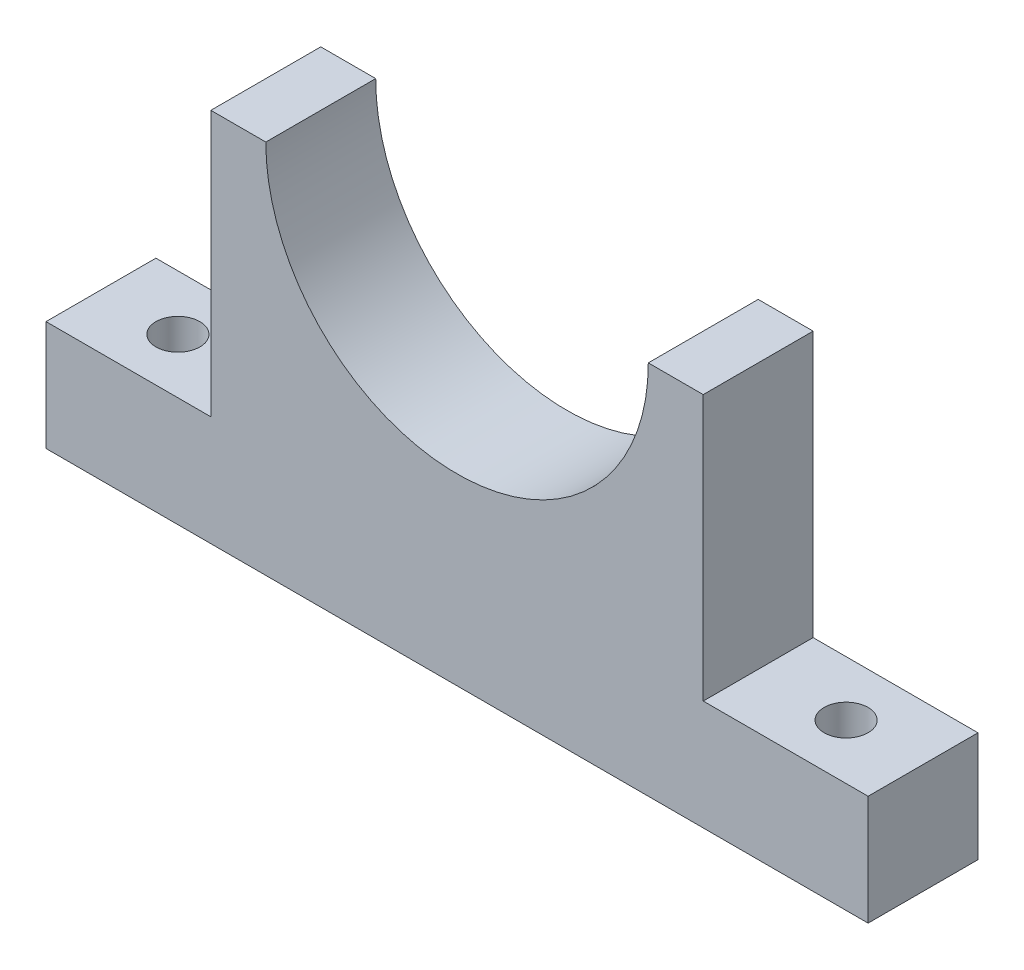
ISO-10303-21;
HEADER;
FILE_DESCRIPTION(('STEP AP214'),'2;1');
FILE_NAME('part.step','',(''),(''),'','','');
FILE_SCHEMA(('AUTOMOTIVE_DESIGN { 1 0 10303 214 1 1 1 1 }'));
ENDSEC;
DATA;
#1=APPLICATION_CONTEXT('core data for automotive mechanical design processes');
#2=APPLICATION_PROTOCOL_DEFINITION('international standard','automotive_design',2000,#1);
#3=PRODUCT_CONTEXT('',#1,'mechanical');
#4=PRODUCT('Part','Part','',(#3));
#5=PRODUCT_RELATED_PRODUCT_CATEGORY('part','',(#4));
#6=PRODUCT_DEFINITION_FORMATION('','',#4);
#7=PRODUCT_DEFINITION_CONTEXT('part definition',#1,'design');
#8=PRODUCT_DEFINITION('design','',#6,#7);
#9=PRODUCT_DEFINITION_SHAPE('','',#8);
#10=(LENGTH_UNIT() NAMED_UNIT(*) SI_UNIT(.MILLI.,.METRE.));
#11=(NAMED_UNIT(*) PLANE_ANGLE_UNIT() SI_UNIT($,.RADIAN.));
#12=(NAMED_UNIT(*) SI_UNIT($,.STERADIAN.) SOLID_ANGLE_UNIT());
#13=UNCERTAINTY_MEASURE_WITH_UNIT(LENGTH_MEASURE(1.E-05),#10,'distance_accuracy_value','');
#14=(GEOMETRIC_REPRESENTATION_CONTEXT(3) GLOBAL_UNCERTAINTY_ASSIGNED_CONTEXT((#13)) GLOBAL_UNIT_ASSIGNED_CONTEXT((#10,
#11,#12)) REPRESENTATION_CONTEXT('',''));
#15=CARTESIAN_POINT('',(0.,0.,0.));
#16=DIRECTION('',(0.,0.,1.));
#17=DIRECTION('',(1.,0.,0.));
#18=AXIS2_PLACEMENT_3D('',#15,#16,#17);
#19=CARTESIAN_POINT('',(22.3999281607712,-17.075,10.));
#20=DIRECTION('',(-1.,0.,0.));
#21=DIRECTION('',(0.,-1.,0.));
#22=AXIS2_PLACEMENT_3D('',#19,#20,#21);
#23=PLANE('',#22);
#24=DIRECTION('',(0.,0.,1.));
#25=VECTOR('',#24,1.);
#26=CARTESIAN_POINT('',(22.3999281607712,-7.075,10.));
#27=LINE('',#26,#25);
#28=CARTESIAN_POINT('',(22.3999281607712,-7.075,0.));
#29=VERTEX_POINT('',#28);
#30=CARTESIAN_POINT('',(22.3999281607712,-7.075,10.));
#31=VERTEX_POINT('',#30);
#32=EDGE_CURVE('E54',#29,#31,#27,.T.);
#33=ORIENTED_EDGE('',*,*,#32,.F.);
#34=DIRECTION('',(0.,1.,0.));
#35=VECTOR('',#34,1.);
#36=CARTESIAN_POINT('',(22.3999281607712,-17.075,0.));
#37=LINE('',#36,#35);
#38=CARTESIAN_POINT('',(22.3999281607712,17.075,0.));
#39=VERTEX_POINT('',#38);
#40=EDGE_CURVE('E176',#29,#39,#37,.T.);
#41=ORIENTED_EDGE('',*,*,#40,.T.);
#42=DIRECTION('',(0.,0.,-1.));
#43=VECTOR('',#42,1.);
#44=CARTESIAN_POINT('',(22.3999281607712,17.075,10.));
#45=LINE('',#44,#43);
#46=CARTESIAN_POINT('',(22.3999281607712,17.075,10.));
#47=VERTEX_POINT('',#46);
#48=EDGE_CURVE('E182',#47,#39,#45,.T.);
#49=ORIENTED_EDGE('',*,*,#48,.F.);
#50=DIRECTION('',(0.,1.,0.));
#51=VECTOR('',#50,1.);
#52=CARTESIAN_POINT('',(22.3999281607712,-17.075,10.));
#53=LINE('',#52,#51);
#54=EDGE_CURVE('E129',#31,#47,#53,.T.);
#55=ORIENTED_EDGE('',*,*,#54,.F.);
#56=EDGE_LOOP('',(#33,#41,#49,#55));
#57=FACE_BOUND('',#56,.T.);
#58=ADVANCED_FACE('F39',(#57),#23,.F.);
#59=CARTESIAN_POINT('',(-22.3999281607712,-17.075,10.));
#60=DIRECTION('',(1.,0.,0.));
#61=DIRECTION('',(0.,1.,0.));
#62=AXIS2_PLACEMENT_3D('',#59,#60,#61);
#63=PLANE('',#62);
#64=DIRECTION('',(0.,0.,-1.));
#65=VECTOR('',#64,1.);
#66=CARTESIAN_POINT('',(-22.3999281607712,-7.075,0.));
#67=LINE('',#66,#65);
#68=CARTESIAN_POINT('',(-22.3999281607712,-7.075,10.));
#69=VERTEX_POINT('',#68);
#70=CARTESIAN_POINT('',(-22.3999281607712,-7.075,0.));
#71=VERTEX_POINT('',#70);
#72=EDGE_CURVE('E62',#69,#71,#67,.T.);
#73=ORIENTED_EDGE('',*,*,#72,.F.);
#74=DIRECTION('',(0.,-1.,0.));
#75=VECTOR('',#74,1.);
#76=CARTESIAN_POINT('',(-22.3999281607712,-17.075,10.));
#77=LINE('',#76,#75);
#78=CARTESIAN_POINT('',(-22.3999281607713,17.075,10.));
#79=VERTEX_POINT('',#78);
#80=EDGE_CURVE('E130',#79,#69,#77,.T.);
#81=ORIENTED_EDGE('',*,*,#80,.F.);
#82=DIRECTION('',(0.,0.,-1.));
#83=VECTOR('',#82,1.);
#84=CARTESIAN_POINT('',(-22.3999281607713,17.075,10.));
#85=LINE('',#84,#83);
#86=CARTESIAN_POINT('',(-22.3999281607713,17.075,0.));
#87=VERTEX_POINT('',#86);
#88=EDGE_CURVE('E195',#79,#87,#85,.T.);
#89=ORIENTED_EDGE('',*,*,#88,.T.);
#90=DIRECTION('',(0.,-1.,0.));
#91=VECTOR('',#90,1.);
#92=CARTESIAN_POINT('',(-22.3999281607712,-17.075,0.));
#93=LINE('',#92,#91);
#94=EDGE_CURVE('E189',#87,#71,#93,.T.);
#95=ORIENTED_EDGE('',*,*,#94,.T.);
#96=EDGE_LOOP('',(#73,#81,#89,#95));
#97=FACE_BOUND('',#96,.T.);
#98=ADVANCED_FACE('F211',(#97),#63,.F.);
#99=CARTESIAN_POINT('',(17.3999281607712,17.075,10.));
#100=DIRECTION('',(0.,-1.,0.));
#101=DIRECTION('',(0.,0.,-1.));
#102=AXIS2_PLACEMENT_3D('',#99,#100,#101);
#103=PLANE('',#102);
#104=DIRECTION('',(-1.,0.,0.));
#105=VECTOR('',#104,1.);
#106=CARTESIAN_POINT('',(17.3999281607712,17.075,0.));
#107=LINE('',#106,#105);
#108=CARTESIAN_POINT('',(17.3999281607712,17.075,0.));
#109=VERTEX_POINT('',#108);
#110=EDGE_CURVE('E172',#39,#109,#107,.T.);
#111=ORIENTED_EDGE('',*,*,#110,.T.);
#112=DIRECTION('',(0.,0.,-1.));
#113=VECTOR('',#112,1.);
#114=CARTESIAN_POINT('',(17.3999281607712,17.075,10.));
#115=LINE('',#114,#113);
#116=CARTESIAN_POINT('',(17.3999281607712,17.075,10.));
#117=VERTEX_POINT('',#116);
#118=EDGE_CURVE('E11',#117,#109,#115,.T.);
#119=ORIENTED_EDGE('',*,*,#118,.F.);
#120=DIRECTION('',(-1.,0.,0.));
#121=VECTOR('',#120,1.);
#122=CARTESIAN_POINT('',(17.3999281607712,17.075,10.));
#123=LINE('',#122,#121);
#124=EDGE_CURVE('E173',#47,#117,#123,.T.);
#125=ORIENTED_EDGE('',*,*,#124,.F.);
#126=ORIENTED_EDGE('',*,*,#48,.T.);
#127=EDGE_LOOP('',(#111,#119,#125,#126));
#128=FACE_BOUND('',#127,.T.);
#129=ADVANCED_FACE('F41',(#128),#103,.F.);
#130=CARTESIAN_POINT('',(0.,17.025,10.));
#131=DIRECTION('',(0.,0.,-1.));
#132=DIRECTION('',(-1.,0.,0.));
#133=AXIS2_PLACEMENT_3D('',#130,#131,#132);
#134=CYLINDRICAL_SURFACE('',#133,17.4);
#135=CARTESIAN_POINT('',(0.,17.025,0.));
#136=DIRECTION('',(0.,0.,-1.));
#137=DIRECTION('',(-1.,0.,0.));
#138=AXIS2_PLACEMENT_3D('',#135,#136,#137);
#139=CIRCLE('',#138,17.4);
#140=CARTESIAN_POINT('',(-17.3999281607713,17.075,0.));
#141=VERTEX_POINT('',#140);
#142=EDGE_CURVE('E185',#109,#141,#139,.T.);
#143=ORIENTED_EDGE('',*,*,#142,.T.);
#144=DIRECTION('',(0.,0.,-1.));
#145=VECTOR('',#144,1.);
#146=CARTESIAN_POINT('',(-17.3999281607713,17.075,10.));
#147=LINE('',#146,#145);
#148=CARTESIAN_POINT('',(-17.3999281607713,17.075,10.));
#149=VERTEX_POINT('',#148);
#150=EDGE_CURVE('E47',#149,#141,#147,.T.);
#151=ORIENTED_EDGE('',*,*,#150,.F.);
#152=CARTESIAN_POINT('',(0.,17.025,10.));
#153=DIRECTION('',(0.,0.,-1.));
#154=DIRECTION('',(-1.,0.,0.));
#155=AXIS2_PLACEMENT_3D('',#152,#153,#154);
#156=CIRCLE('',#155,17.4);
#157=EDGE_CURVE('E175',#117,#149,#156,.T.);
#158=ORIENTED_EDGE('',*,*,#157,.F.);
#159=ORIENTED_EDGE('',*,*,#118,.T.);
#160=EDGE_LOOP('',(#143,#151,#158,#159));
#161=FACE_BOUND('',#160,.T.);
#162=ADVANCED_FACE('F217',(#161),#134,.F.);
#163=CARTESIAN_POINT('',(-22.3999281607713,17.075,10.));
#164=DIRECTION('',(0.,-1.,0.));
#165=DIRECTION('',(0.,0.,-1.));
#166=AXIS2_PLACEMENT_3D('',#163,#164,#165);
#167=PLANE('',#166);
#168=DIRECTION('',(-1.,0.,0.));
#169=VECTOR('',#168,1.);
#170=CARTESIAN_POINT('',(-22.3999281607713,17.075,0.));
#171=LINE('',#170,#169);
#172=EDGE_CURVE('E187',#141,#87,#171,.T.);
#173=ORIENTED_EDGE('',*,*,#172,.T.);
#174=ORIENTED_EDGE('',*,*,#88,.F.);
#175=DIRECTION('',(-1.,0.,0.));
#176=VECTOR('',#175,1.);
#177=CARTESIAN_POINT('',(-22.3999281607713,17.075,10.));
#178=LINE('',#177,#176);
#179=EDGE_CURVE('E178',#149,#79,#178,.T.);
#180=ORIENTED_EDGE('',*,*,#179,.F.);
#181=ORIENTED_EDGE('',*,*,#150,.T.);
#182=EDGE_LOOP('',(#173,#174,#180,#181));
#183=FACE_BOUND('',#182,.T.);
#184=ADVANCED_FACE('F202',(#183),#167,.F.);
#185=CARTESIAN_POINT('',(-22.3999281607712,-17.075,10.));
#186=DIRECTION('',(0.,1.,0.));
#187=DIRECTION('',(0.,0.,1.));
#188=AXIS2_PLACEMENT_3D('',#185,#186,#187);
#189=PLANE('',#188);
#190=CARTESIAN_POINT('',(-30.3999281607712,-17.075,5.));
#191=DIRECTION('',(0.,1.,0.));
#192=DIRECTION('',(0.,0.,1.));
#193=AXIS2_PLACEMENT_3D('',#190,#191,#192);
#194=CIRCLE('',#193,2.);
#195=CARTESIAN_POINT('',(-30.3999281607712,-17.075,7.));
#196=VERTEX_POINT('',#195);
#197=EDGE_CURVE('E145',#196,#196,#194,.T.);
#198=ORIENTED_EDGE('',*,*,#197,.T.);
#199=EDGE_LOOP('',(#198));
#200=FACE_BOUND('',#199,.T.);
#201=CARTESIAN_POINT('',(30.3999281607712,-17.075,5.00000000000004));
#202=DIRECTION('',(0.,1.,0.));
#203=DIRECTION('',(0.,0.,1.));
#204=AXIS2_PLACEMENT_3D('',#201,#202,#203);
#205=CIRCLE('',#204,2.);
#206=CARTESIAN_POINT('',(30.3999281607712,-17.075,7.00000000000004));
#207=VERTEX_POINT('',#206);
#208=EDGE_CURVE('E354',#207,#207,#205,.T.);
#209=ORIENTED_EDGE('',*,*,#208,.T.);
#210=EDGE_LOOP('',(#209));
#211=FACE_BOUND('',#210,.T.);
#212=DIRECTION('',(1.,0.,0.));
#213=VECTOR('',#212,1.);
#214=CARTESIAN_POINT('',(-22.3999281607712,-17.075,0.));
#215=LINE('',#214,#213);
#216=CARTESIAN_POINT('',(-37.3999281607712,-17.075,0.));
#217=VERTEX_POINT('',#216);
#218=CARTESIAN_POINT('',(37.3999281607712,-17.075,0.));
#219=VERTEX_POINT('',#218);
#220=EDGE_CURVE('E135',#217,#219,#215,.T.);
#221=ORIENTED_EDGE('',*,*,#220,.T.);
#222=DIRECTION('',(0.,0.,-1.));
#223=VECTOR('',#222,1.);
#224=CARTESIAN_POINT('',(37.3999281607712,-17.075,10.));
#225=LINE('',#224,#223);
#226=CARTESIAN_POINT('',(37.3999281607712,-17.075,10.));
#227=VERTEX_POINT('',#226);
#228=EDGE_CURVE('E133',#227,#219,#225,.T.);
#229=ORIENTED_EDGE('',*,*,#228,.F.);
#230=DIRECTION('',(1.,0.,0.));
#231=VECTOR('',#230,1.);
#232=CARTESIAN_POINT('',(-22.3999281607712,-17.075,10.));
#233=LINE('',#232,#231);
#234=CARTESIAN_POINT('',(-37.3999281607712,-17.075,10.));
#235=VERTEX_POINT('',#234);
#236=EDGE_CURVE('E117',#235,#227,#233,.T.);
#237=ORIENTED_EDGE('',*,*,#236,.F.);
#238=DIRECTION('',(0.,0.,1.));
#239=VECTOR('',#238,1.);
#240=CARTESIAN_POINT('',(-37.3999281607712,-17.075,0.));
#241=LINE('',#240,#239);
#242=EDGE_CURVE('E160',#217,#235,#241,.T.);
#243=ORIENTED_EDGE('',*,*,#242,.F.);
#244=EDGE_LOOP('',(#221,#229,#237,#243));
#245=FACE_BOUND('',#244,.T.);
#246=ADVANCED_FACE('F134',(#200,#211,#245),#189,.F.);
#247=CARTESIAN_POINT('',(0.,17.025,10.));
#248=DIRECTION('',(0.,0.,-1.));
#249=DIRECTION('',(-1.,0.,0.));
#250=AXIS2_PLACEMENT_3D('',#247,#248,#249);
#251=PLANE('',#250);
#252=ORIENTED_EDGE('',*,*,#124,.T.);
#253=ORIENTED_EDGE('',*,*,#157,.T.);
#254=ORIENTED_EDGE('',*,*,#179,.T.);
#255=ORIENTED_EDGE('',*,*,#80,.T.);
#256=DIRECTION('',(1.,0.,0.));
#257=VECTOR('',#256,1.);
#258=CARTESIAN_POINT('',(-37.3999281607712,-7.07500000000001,10.));
#259=LINE('',#258,#257);
#260=CARTESIAN_POINT('',(-37.3999281607712,-7.07500000000001,10.));
#261=VERTEX_POINT('',#260);
#262=EDGE_CURVE('E169',#261,#69,#259,.T.);
#263=ORIENTED_EDGE('',*,*,#262,.F.);
#264=DIRECTION('',(0.,1.,0.));
#265=VECTOR('',#264,1.);
#266=CARTESIAN_POINT('',(-37.3999281607712,-17.075,10.));
#267=LINE('',#266,#265);
#268=EDGE_CURVE('E125',#235,#261,#267,.T.);
#269=ORIENTED_EDGE('',*,*,#268,.F.);
#270=ORIENTED_EDGE('',*,*,#236,.T.);
#271=DIRECTION('',(0.,-1.,0.));
#272=VECTOR('',#271,1.);
#273=CARTESIAN_POINT('',(37.3999281607712,-17.075,10.));
#274=LINE('',#273,#272);
#275=CARTESIAN_POINT('',(37.3999281607712,-7.075,10.));
#276=VERTEX_POINT('',#275);
#277=EDGE_CURVE('E123',#276,#227,#274,.T.);
#278=ORIENTED_EDGE('',*,*,#277,.F.);
#279=DIRECTION('',(-1.,0.,0.));
#280=VECTOR('',#279,1.);
#281=CARTESIAN_POINT('',(37.3999281607712,-7.075,10.));
#282=LINE('',#281,#280);
#283=EDGE_CURVE('E151',#276,#31,#282,.T.);
#284=ORIENTED_EDGE('',*,*,#283,.T.);
#285=ORIENTED_EDGE('',*,*,#54,.T.);
#286=EDGE_LOOP('',(#252,#253,#254,#255,#263,#269,#270,#278,#284,#285));
#287=FACE_BOUND('',#286,.T.);
#288=ADVANCED_FACE('F120',(#287),#251,.F.);
#289=CARTESIAN_POINT('',(0.,17.025,0.));
#290=DIRECTION('',(0.,0.,-1.));
#291=DIRECTION('',(-1.,0.,0.));
#292=AXIS2_PLACEMENT_3D('',#289,#290,#291);
#293=PLANE('',#292);
#294=ORIENTED_EDGE('',*,*,#110,.F.);
#295=ORIENTED_EDGE('',*,*,#40,.F.);
#296=DIRECTION('',(-1.,0.,0.));
#297=VECTOR('',#296,1.);
#298=CARTESIAN_POINT('',(37.3999281607712,-7.075,0.));
#299=LINE('',#298,#297);
#300=CARTESIAN_POINT('',(37.3999281607712,-7.075,0.));
#301=VERTEX_POINT('',#300);
#302=EDGE_CURVE('E154',#301,#29,#299,.T.);
#303=ORIENTED_EDGE('',*,*,#302,.F.);
#304=DIRECTION('',(0.,1.,0.));
#305=VECTOR('',#304,1.);
#306=CARTESIAN_POINT('',(37.3999281607712,-17.075,0.));
#307=LINE('',#306,#305);
#308=EDGE_CURVE('E138',#219,#301,#307,.T.);
#309=ORIENTED_EDGE('',*,*,#308,.F.);
#310=ORIENTED_EDGE('',*,*,#220,.F.);
#311=DIRECTION('',(0.,-1.,0.));
#312=VECTOR('',#311,1.);
#313=CARTESIAN_POINT('',(-37.3999281607712,-17.075,0.));
#314=LINE('',#313,#312);
#315=CARTESIAN_POINT('',(-37.3999281607712,-7.07500000000001,0.));
#316=VERTEX_POINT('',#315);
#317=EDGE_CURVE('E157',#316,#217,#314,.T.);
#318=ORIENTED_EDGE('',*,*,#317,.F.);
#319=DIRECTION('',(1.,0.,0.));
#320=VECTOR('',#319,1.);
#321=CARTESIAN_POINT('',(-37.3999281607712,-7.07500000000001,0.));
#322=LINE('',#321,#320);
#323=EDGE_CURVE('E165',#316,#71,#322,.T.);
#324=ORIENTED_EDGE('',*,*,#323,.T.);
#325=ORIENTED_EDGE('',*,*,#94,.F.);
#326=ORIENTED_EDGE('',*,*,#172,.F.);
#327=ORIENTED_EDGE('',*,*,#142,.F.);
#328=EDGE_LOOP('',(#294,#295,#303,#309,#310,#318,#324,#325,#326,#327));
#329=FACE_BOUND('',#328,.T.);
#330=ADVANCED_FACE('F208',(#329),#293,.T.);
#331=CARTESIAN_POINT('',(-37.3999281607712,-7.07500000000001,0.));
#332=DIRECTION('',(0.,-1.,0.));
#333=DIRECTION('',(1.,0.,0.));
#334=AXIS2_PLACEMENT_3D('',#331,#332,#333);
#335=PLANE('',#334);
#336=CARTESIAN_POINT('',(-30.3999281607712,-7.075,5.));
#337=DIRECTION('',(0.,1.,0.));
#338=DIRECTION('',(-1.,0.,0.));
#339=AXIS2_PLACEMENT_3D('',#336,#337,#338);
#340=CIRCLE('',#339,2.);
#341=CARTESIAN_POINT('',(-32.3999281607713,-7.075,5.));
#342=VERTEX_POINT('',#341);
#343=EDGE_CURVE('E351',#342,#342,#340,.T.);
#344=ORIENTED_EDGE('',*,*,#343,.F.);
#345=EDGE_LOOP('',(#344));
#346=FACE_BOUND('',#345,.T.);
#347=ORIENTED_EDGE('',*,*,#72,.T.);
#348=ORIENTED_EDGE('',*,*,#323,.F.);
#349=DIRECTION('',(0.,0.,-1.));
#350=VECTOR('',#349,1.);
#351=CARTESIAN_POINT('',(-37.3999281607712,-7.07500000000001,0.));
#352=LINE('',#351,#350);
#353=EDGE_CURVE('E163',#261,#316,#352,.T.);
#354=ORIENTED_EDGE('',*,*,#353,.F.);
#355=ORIENTED_EDGE('',*,*,#262,.T.);
#356=EDGE_LOOP('',(#347,#348,#354,#355));
#357=FACE_BOUND('',#356,.T.);
#358=ADVANCED_FACE('F213',(#346,#357),#335,.F.);
#359=CARTESIAN_POINT('',(-37.3999281607713,0.,0.));
#360=DIRECTION('',(1.,0.,0.));
#361=DIRECTION('',(0.,1.,0.));
#362=AXIS2_PLACEMENT_3D('',#359,#360,#361);
#363=PLANE('',#362);
#364=ORIENTED_EDGE('',*,*,#317,.T.);
#365=ORIENTED_EDGE('',*,*,#242,.T.);
#366=ORIENTED_EDGE('',*,*,#268,.T.);
#367=ORIENTED_EDGE('',*,*,#353,.T.);
#368=EDGE_LOOP('',(#364,#365,#366,#367));
#369=FACE_BOUND('',#368,.T.);
#370=ADVANCED_FACE('F256',(#369),#363,.F.);
#371=CARTESIAN_POINT('',(37.3999281607712,-7.075,10.));
#372=DIRECTION('',(0.,-1.,0.));
#373=DIRECTION('',(1.,0.,0.));
#374=AXIS2_PLACEMENT_3D('',#371,#372,#373);
#375=PLANE('',#374);
#376=CARTESIAN_POINT('',(30.3999281607712,-7.07499999999999,5.00000000000004));
#377=DIRECTION('',(0.,1.,0.));
#378=DIRECTION('',(1.,0.,0.));
#379=AXIS2_PLACEMENT_3D('',#376,#377,#378);
#380=CIRCLE('',#379,2.);
#381=CARTESIAN_POINT('',(32.3999281607712,-7.07499999999999,5.00000000000004));
#382=VERTEX_POINT('',#381);
#383=EDGE_CURVE('E358',#382,#382,#380,.T.);
#384=ORIENTED_EDGE('',*,*,#383,.F.);
#385=EDGE_LOOP('',(#384));
#386=FACE_BOUND('',#385,.T.);
#387=ORIENTED_EDGE('',*,*,#32,.T.);
#388=ORIENTED_EDGE('',*,*,#283,.F.);
#389=DIRECTION('',(0.,0.,1.));
#390=VECTOR('',#389,1.);
#391=CARTESIAN_POINT('',(37.3999281607712,-7.075,10.));
#392=LINE('',#391,#390);
#393=EDGE_CURVE('E142',#301,#276,#392,.T.);
#394=ORIENTED_EDGE('',*,*,#393,.F.);
#395=ORIENTED_EDGE('',*,*,#302,.T.);
#396=EDGE_LOOP('',(#387,#388,#394,#395));
#397=FACE_BOUND('',#396,.T.);
#398=ADVANCED_FACE('F222',(#386,#397),#375,.F.);
#399=CARTESIAN_POINT('',(37.3999281607712,0.,0.));
#400=DIRECTION('',(-1.,0.,0.));
#401=DIRECTION('',(0.,-1.,0.));
#402=AXIS2_PLACEMENT_3D('',#399,#400,#401);
#403=PLANE('',#402);
#404=ORIENTED_EDGE('',*,*,#277,.T.);
#405=ORIENTED_EDGE('',*,*,#228,.T.);
#406=ORIENTED_EDGE('',*,*,#308,.T.);
#407=ORIENTED_EDGE('',*,*,#393,.T.);
#408=EDGE_LOOP('',(#404,#405,#406,#407));
#409=FACE_BOUND('',#408,.T.);
#410=ADVANCED_FACE('F140',(#409),#403,.F.);
#411=CARTESIAN_POINT('',(30.3999281607712,-27.075,5.00000000000004));
#412=DIRECTION('',(0.,1.,0.));
#413=DIRECTION('',(-1.,0.,0.));
#414=AXIS2_PLACEMENT_3D('',#411,#412,#413);
#415=CYLINDRICAL_SURFACE('',#414,2.);
#416=ORIENTED_EDGE('',*,*,#383,.T.);
#417=EDGE_LOOP('',(#416));
#418=FACE_BOUND('',#417,.T.);
#419=ORIENTED_EDGE('',*,*,#208,.F.);
#420=EDGE_LOOP('',(#419));
#421=FACE_BOUND('',#420,.T.);
#422=ADVANCED_FACE('F298',(#418,#421),#415,.F.);
#423=CARTESIAN_POINT('',(-30.3999281607712,-27.075,5.));
#424=DIRECTION('',(0.,1.,0.));
#425=DIRECTION('',(-1.,0.,0.));
#426=AXIS2_PLACEMENT_3D('',#423,#424,#425);
#427=CYLINDRICAL_SURFACE('',#426,2.);
#428=ORIENTED_EDGE('',*,*,#343,.T.);
#429=EDGE_LOOP('',(#428));
#430=FACE_BOUND('',#429,.T.);
#431=ORIENTED_EDGE('',*,*,#197,.F.);
#432=EDGE_LOOP('',(#431));
#433=FACE_BOUND('',#432,.T.);
#434=ADVANCED_FACE('F328',(#430,#433),#427,.F.);
#435=CLOSED_SHELL('',(#58,#98,#129,#162,#184,#246,#288,#330,#358,#370,#398,#410,#422,#434));
#436=MANIFOLD_SOLID_BREP('B2',#435);
#437=ADVANCED_BREP_SHAPE_REPRESENTATION('',(#18,#436),#14);
#438=SHAPE_DEFINITION_REPRESENTATION(#9,#437);
ENDSEC;
END-ISO-10303-21;
